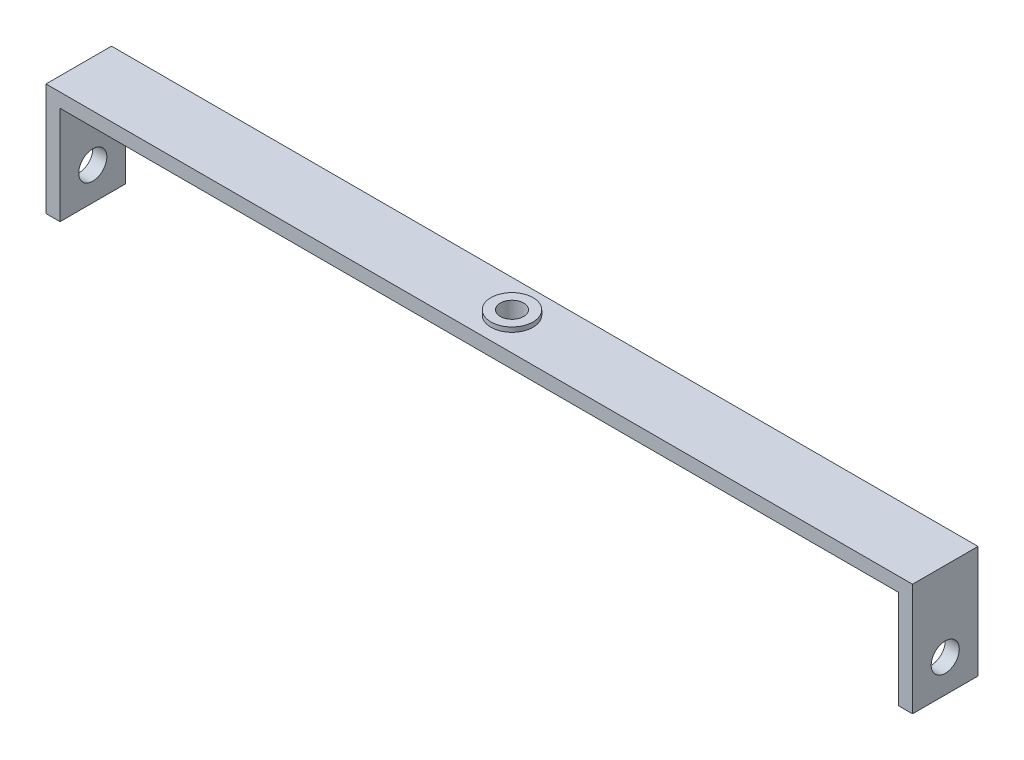
ISO-10303-21;
HEADER;
FILE_DESCRIPTION(('STEP AP214'),'2;1');
FILE_NAME('part.step','',(''),(''),'','','');
FILE_SCHEMA(('AUTOMOTIVE_DESIGN { 1 0 10303 214 1 1 1 1 }'));
ENDSEC;
DATA;
#1=APPLICATION_CONTEXT('core data for automotive mechanical design processes');
#2=APPLICATION_PROTOCOL_DEFINITION('international standard','automotive_design',2000,#1);
#3=PRODUCT_CONTEXT('',#1,'mechanical');
#4=PRODUCT('Part','Part','',(#3));
#5=PRODUCT_RELATED_PRODUCT_CATEGORY('part','',(#4));
#6=PRODUCT_DEFINITION_FORMATION('','',#4);
#7=PRODUCT_DEFINITION_CONTEXT('part definition',#1,'design');
#8=PRODUCT_DEFINITION('design','',#6,#7);
#9=PRODUCT_DEFINITION_SHAPE('','',#8);
#10=(LENGTH_UNIT() NAMED_UNIT(*) SI_UNIT(.MILLI.,.METRE.));
#11=(NAMED_UNIT(*) PLANE_ANGLE_UNIT() SI_UNIT($,.RADIAN.));
#12=(NAMED_UNIT(*) SI_UNIT($,.STERADIAN.) SOLID_ANGLE_UNIT());
#13=UNCERTAINTY_MEASURE_WITH_UNIT(LENGTH_MEASURE(1.E-05),#10,'distance_accuracy_value','');
#14=(GEOMETRIC_REPRESENTATION_CONTEXT(3) GLOBAL_UNCERTAINTY_ASSIGNED_CONTEXT((#13)) GLOBAL_UNIT_ASSIGNED_CONTEXT((#10,
#11,#12)) REPRESENTATION_CONTEXT('',''));
#15=CARTESIAN_POINT('',(0.,0.,0.));
#16=DIRECTION('',(0.,0.,1.));
#17=DIRECTION('',(1.,0.,0.));
#18=AXIS2_PLACEMENT_3D('',#15,#16,#17);
#19=CARTESIAN_POINT('',(-46.3,0.,-3.5));
#20=DIRECTION('',(0.,1.,0.));
#21=DIRECTION('',(-1.,0.,0.));
#22=AXIS2_PLACEMENT_3D('',#19,#20,#21);
#23=PLANE('',#22);
#24=DIRECTION('',(0.,0.,1.));
#25=VECTOR('',#24,1.);
#26=CARTESIAN_POINT('',(-46.3,0.,-3.5));
#27=LINE('',#26,#25);
#28=CARTESIAN_POINT('',(-46.3,0.,-3.5));
#29=VERTEX_POINT('',#28);
#30=CARTESIAN_POINT('',(-46.3,0.,3.5));
#31=VERTEX_POINT('',#30);
#32=EDGE_CURVE('E168',#29,#31,#27,.T.);
#33=ORIENTED_EDGE('',*,*,#32,.T.);
#34=DIRECTION('',(-1.,0.,0.));
#35=VECTOR('',#34,1.);
#36=CARTESIAN_POINT('',(-46.3,0.,3.5));
#37=LINE('',#36,#35);
#38=CARTESIAN_POINT('',(46.3,0.,3.5));
#39=VERTEX_POINT('',#38);
#40=EDGE_CURVE('E117',#39,#31,#37,.T.);
#41=ORIENTED_EDGE('',*,*,#40,.F.);
#42=DIRECTION('',(0.,0.,1.));
#43=VECTOR('',#42,1.);
#44=CARTESIAN_POINT('',(46.3,0.,-3.5));
#45=LINE('',#44,#43);
#46=CARTESIAN_POINT('',(46.3,0.,-3.5));
#47=VERTEX_POINT('',#46);
#48=EDGE_CURVE('E109',#47,#39,#45,.T.);
#49=ORIENTED_EDGE('',*,*,#48,.F.);
#50=DIRECTION('',(-1.,0.,0.));
#51=VECTOR('',#50,1.);
#52=CARTESIAN_POINT('',(-46.3,0.,-3.5));
#53=LINE('',#52,#51);
#54=EDGE_CURVE('E146',#47,#29,#53,.T.);
#55=ORIENTED_EDGE('',*,*,#54,.T.);
#56=EDGE_LOOP('',(#33,#41,#49,#55));
#57=FACE_BOUND('',#56,.T.);
#58=CARTESIAN_POINT('',(0.,0.,0.));
#59=DIRECTION('',(0.,1.,0.));
#60=DIRECTION('',(0.,0.,1.));
#61=AXIS2_PLACEMENT_3D('',#58,#59,#60);
#62=CIRCLE('',#61,2.25);
#63=CARTESIAN_POINT('',(0.,0.,2.25));
#64=VERTEX_POINT('',#63);
#65=EDGE_CURVE('E234',#64,#64,#62,.T.);
#66=ORIENTED_EDGE('',*,*,#65,.F.);
#67=EDGE_LOOP('',(#66));
#68=FACE_BOUND('',#67,.T.);
#69=ADVANCED_FACE('F39',(#57,#68),#23,.T.);
#70=CARTESIAN_POINT('',(44.8,-12.,-3.5));
#71=DIRECTION('',(0.,-1.,0.));
#72=DIRECTION('',(0.,0.,-1.));
#73=AXIS2_PLACEMENT_3D('',#70,#71,#72);
#74=PLANE('',#73);
#75=DIRECTION('',(0.,0.,1.));
#76=VECTOR('',#75,1.);
#77=CARTESIAN_POINT('',(46.3,-12.,-3.5));
#78=LINE('',#77,#76);
#79=CARTESIAN_POINT('',(46.3,-12.,-3.5));
#80=VERTEX_POINT('',#79);
#81=CARTESIAN_POINT('',(46.3,-12.,3.5));
#82=VERTEX_POINT('',#81);
#83=EDGE_CURVE('E43',#80,#82,#78,.T.);
#84=ORIENTED_EDGE('',*,*,#83,.T.);
#85=DIRECTION('',(1.,0.,0.));
#86=VECTOR('',#85,1.);
#87=CARTESIAN_POINT('',(44.8,-12.,3.5));
#88=LINE('',#87,#86);
#89=CARTESIAN_POINT('',(44.8,-12.,3.5));
#90=VERTEX_POINT('',#89);
#91=EDGE_CURVE('E104',#90,#82,#88,.T.);
#92=ORIENTED_EDGE('',*,*,#91,.F.);
#93=DIRECTION('',(0.,0.,1.));
#94=VECTOR('',#93,1.);
#95=CARTESIAN_POINT('',(44.8,-12.,-3.5));
#96=LINE('',#95,#94);
#97=CARTESIAN_POINT('',(44.8,-12.,-3.5));
#98=VERTEX_POINT('',#97);
#99=EDGE_CURVE('E11',#98,#90,#96,.T.);
#100=ORIENTED_EDGE('',*,*,#99,.F.);
#101=DIRECTION('',(1.,0.,0.));
#102=VECTOR('',#101,1.);
#103=CARTESIAN_POINT('',(44.8,-12.,-3.5));
#104=LINE('',#103,#102);
#105=EDGE_CURVE('E105',#98,#80,#104,.T.);
#106=ORIENTED_EDGE('',*,*,#105,.T.);
#107=EDGE_LOOP('',(#84,#92,#100,#106));
#108=FACE_BOUND('',#107,.T.);
#109=ADVANCED_FACE('F41',(#108),#74,.T.);
#110=CARTESIAN_POINT('',(44.8,-1.5,-3.5));
#111=DIRECTION('',(-1.,0.,0.));
#112=DIRECTION('',(0.,0.,1.));
#113=AXIS2_PLACEMENT_3D('',#110,#111,#112);
#114=PLANE('',#113);
#115=CARTESIAN_POINT('',(44.8,-8.5,0.));
#116=DIRECTION('',(-1.,0.,0.));
#117=DIRECTION('',(0.,0.,1.));
#118=AXIS2_PLACEMENT_3D('',#115,#116,#117);
#119=CIRCLE('',#118,1.5);
#120=CARTESIAN_POINT('',(44.8,-8.5,-1.5));
#121=VERTEX_POINT('',#120);
#122=EDGE_CURVE('E228',#121,#121,#119,.T.);
#123=ORIENTED_EDGE('',*,*,#122,.F.);
#124=EDGE_LOOP('',(#123));
#125=FACE_BOUND('',#124,.T.);
#126=ORIENTED_EDGE('',*,*,#99,.T.);
#127=DIRECTION('',(0.,-1.,0.));
#128=VECTOR('',#127,1.);
#129=CARTESIAN_POINT('',(44.8,-1.5,3.5));
#130=LINE('',#129,#128);
#131=CARTESIAN_POINT('',(44.8,-1.5,3.5));
#132=VERTEX_POINT('',#131);
#133=EDGE_CURVE('E122',#132,#90,#130,.T.);
#134=ORIENTED_EDGE('',*,*,#133,.F.);
#135=DIRECTION('',(0.,0.,1.));
#136=VECTOR('',#135,1.);
#137=CARTESIAN_POINT('',(44.8,-1.5,-3.5));
#138=LINE('',#137,#136);
#139=CARTESIAN_POINT('',(44.8,-1.5,-3.5));
#140=VERTEX_POINT('',#139);
#141=EDGE_CURVE('E48',#140,#132,#138,.T.);
#142=ORIENTED_EDGE('',*,*,#141,.F.);
#143=DIRECTION('',(0.,-1.,0.));
#144=VECTOR('',#143,1.);
#145=CARTESIAN_POINT('',(44.8,-1.5,-3.5));
#146=LINE('',#145,#144);
#147=EDGE_CURVE('E110',#140,#98,#146,.T.);
#148=ORIENTED_EDGE('',*,*,#147,.T.);
#149=EDGE_LOOP('',(#126,#134,#142,#148));
#150=FACE_BOUND('',#149,.T.);
#151=ADVANCED_FACE('F191',(#125,#150),#114,.T.);
#152=CARTESIAN_POINT('',(-44.8,-1.5,-3.5));
#153=DIRECTION('',(0.,-1.,0.));
#154=DIRECTION('',(0.,0.,-1.));
#155=AXIS2_PLACEMENT_3D('',#152,#153,#154);
#156=PLANE('',#155);
#157=CARTESIAN_POINT('',(0.,-1.5,0.));
#158=DIRECTION('',(0.,-1.,0.));
#159=DIRECTION('',(0.,0.,-1.));
#160=AXIS2_PLACEMENT_3D('',#157,#158,#159);
#161=CIRCLE('',#160,1.25);
#162=CARTESIAN_POINT('',(0.,-1.5,-1.25));
#163=VERTEX_POINT('',#162);
#164=EDGE_CURVE('E123',#163,#163,#161,.T.);
#165=ORIENTED_EDGE('',*,*,#164,.F.);
#166=EDGE_LOOP('',(#165));
#167=FACE_BOUND('',#166,.T.);
#168=ORIENTED_EDGE('',*,*,#141,.T.);
#169=DIRECTION('',(1.,0.,0.));
#170=VECTOR('',#169,1.);
#171=CARTESIAN_POINT('',(-44.8,-1.5,3.5));
#172=LINE('',#171,#170);
#173=CARTESIAN_POINT('',(-44.8,-1.5,3.5));
#174=VERTEX_POINT('',#173);
#175=EDGE_CURVE('E140',#174,#132,#172,.T.);
#176=ORIENTED_EDGE('',*,*,#175,.F.);
#177=DIRECTION('',(0.,0.,1.));
#178=VECTOR('',#177,1.);
#179=CARTESIAN_POINT('',(-44.8,-1.5,-3.5));
#180=LINE('',#179,#178);
#181=CARTESIAN_POINT('',(-44.8,-1.5,-3.5));
#182=VERTEX_POINT('',#181);
#183=EDGE_CURVE('E162',#182,#174,#180,.T.);
#184=ORIENTED_EDGE('',*,*,#183,.F.);
#185=DIRECTION('',(1.,0.,0.));
#186=VECTOR('',#185,1.);
#187=CARTESIAN_POINT('',(-44.8,-1.5,-3.5));
#188=LINE('',#187,#186);
#189=EDGE_CURVE('E158',#182,#140,#188,.T.);
#190=ORIENTED_EDGE('',*,*,#189,.T.);
#191=EDGE_LOOP('',(#168,#176,#184,#190));
#192=FACE_BOUND('',#191,.T.);
#193=ADVANCED_FACE('F190',(#167,#192),#156,.T.);
#194=CARTESIAN_POINT('',(-44.8,-1.5,-3.5));
#195=DIRECTION('',(1.,0.,0.));
#196=DIRECTION('',(0.,0.,-1.));
#197=AXIS2_PLACEMENT_3D('',#194,#195,#196);
#198=PLANE('',#197);
#199=CARTESIAN_POINT('',(-44.8,-8.5,0.));
#200=DIRECTION('',(1.,0.,0.));
#201=DIRECTION('',(0.,0.,-1.));
#202=AXIS2_PLACEMENT_3D('',#199,#200,#201);
#203=CIRCLE('',#202,1.5);
#204=CARTESIAN_POINT('',(-44.8,-8.5,-1.5));
#205=VERTEX_POINT('',#204);
#206=EDGE_CURVE('E223',#205,#205,#203,.T.);
#207=ORIENTED_EDGE('',*,*,#206,.F.);
#208=EDGE_LOOP('',(#207));
#209=FACE_BOUND('',#208,.T.);
#210=ORIENTED_EDGE('',*,*,#183,.T.);
#211=DIRECTION('',(0.,1.,0.));
#212=VECTOR('',#211,1.);
#213=CARTESIAN_POINT('',(-44.8,-1.5,3.5));
#214=LINE('',#213,#212);
#215=CARTESIAN_POINT('',(-44.8,-12.,3.5));
#216=VERTEX_POINT('',#215);
#217=EDGE_CURVE('E137',#216,#174,#214,.T.);
#218=ORIENTED_EDGE('',*,*,#217,.F.);
#219=DIRECTION('',(0.,0.,1.));
#220=VECTOR('',#219,1.);
#221=CARTESIAN_POINT('',(-44.8,-12.,-3.5));
#222=LINE('',#221,#220);
#223=CARTESIAN_POINT('',(-44.8,-12.,-3.5));
#224=VERTEX_POINT('',#223);
#225=EDGE_CURVE('E164',#224,#216,#222,.T.);
#226=ORIENTED_EDGE('',*,*,#225,.F.);
#227=DIRECTION('',(0.,1.,0.));
#228=VECTOR('',#227,1.);
#229=CARTESIAN_POINT('',(-44.8,-1.5,-3.5));
#230=LINE('',#229,#228);
#231=EDGE_CURVE('E155',#224,#182,#230,.T.);
#232=ORIENTED_EDGE('',*,*,#231,.T.);
#233=EDGE_LOOP('',(#210,#218,#226,#232));
#234=FACE_BOUND('',#233,.T.);
#235=ADVANCED_FACE('F186',(#209,#234),#198,.T.);
#236=CARTESIAN_POINT('',(-46.3,-12.,-3.5));
#237=DIRECTION('',(0.,-1.,0.));
#238=DIRECTION('',(0.,0.,-1.));
#239=AXIS2_PLACEMENT_3D('',#236,#237,#238);
#240=PLANE('',#239);
#241=ORIENTED_EDGE('',*,*,#225,.T.);
#242=DIRECTION('',(1.,0.,0.));
#243=VECTOR('',#242,1.);
#244=CARTESIAN_POINT('',(-46.3,-12.,3.5));
#245=LINE('',#244,#243);
#246=CARTESIAN_POINT('',(-46.3,-12.,3.5));
#247=VERTEX_POINT('',#246);
#248=EDGE_CURVE('E134',#247,#216,#245,.T.);
#249=ORIENTED_EDGE('',*,*,#248,.F.);
#250=DIRECTION('',(0.,0.,1.));
#251=VECTOR('',#250,1.);
#252=CARTESIAN_POINT('',(-46.3,-12.,-3.5));
#253=LINE('',#252,#251);
#254=CARTESIAN_POINT('',(-46.3,-12.,-3.5));
#255=VERTEX_POINT('',#254);
#256=EDGE_CURVE('E166',#255,#247,#253,.T.);
#257=ORIENTED_EDGE('',*,*,#256,.F.);
#258=DIRECTION('',(1.,0.,0.));
#259=VECTOR('',#258,1.);
#260=CARTESIAN_POINT('',(-46.3,-12.,-3.5));
#261=LINE('',#260,#259);
#262=EDGE_CURVE('E152',#255,#224,#261,.T.);
#263=ORIENTED_EDGE('',*,*,#262,.T.);
#264=EDGE_LOOP('',(#241,#249,#257,#263));
#265=FACE_BOUND('',#264,.T.);
#266=ADVANCED_FACE('F179',(#265),#240,.T.);
#267=CARTESIAN_POINT('',(-46.3,0.,-3.5));
#268=DIRECTION('',(-1.,0.,0.));
#269=DIRECTION('',(0.,-1.,0.));
#270=AXIS2_PLACEMENT_3D('',#267,#268,#269);
#271=PLANE('',#270);
#272=CARTESIAN_POINT('',(-46.3,-8.5,0.));
#273=DIRECTION('',(-1.,0.,0.));
#274=DIRECTION('',(0.,-1.,0.));
#275=AXIS2_PLACEMENT_3D('',#272,#273,#274);
#276=CIRCLE('',#275,1.5);
#277=CARTESIAN_POINT('',(-46.3,-8.5,-1.5));
#278=VERTEX_POINT('',#277);
#279=EDGE_CURVE('E220',#278,#278,#276,.F.);
#280=ORIENTED_EDGE('',*,*,#279,.T.);
#281=EDGE_LOOP('',(#280));
#282=FACE_BOUND('',#281,.T.);
#283=ORIENTED_EDGE('',*,*,#256,.T.);
#284=DIRECTION('',(0.,-1.,0.));
#285=VECTOR('',#284,1.);
#286=CARTESIAN_POINT('',(-46.3,0.,3.5));
#287=LINE('',#286,#285);
#288=EDGE_CURVE('E131',#31,#247,#287,.T.);
#289=ORIENTED_EDGE('',*,*,#288,.F.);
#290=ORIENTED_EDGE('',*,*,#32,.F.);
#291=DIRECTION('',(0.,-1.,0.));
#292=VECTOR('',#291,1.);
#293=CARTESIAN_POINT('',(-46.3,0.,-3.5));
#294=LINE('',#293,#292);
#295=EDGE_CURVE('E149',#29,#255,#294,.T.);
#296=ORIENTED_EDGE('',*,*,#295,.T.);
#297=EDGE_LOOP('',(#283,#289,#290,#296));
#298=FACE_BOUND('',#297,.T.);
#299=ADVANCED_FACE('F176',(#282,#298),#271,.T.);
#300=CARTESIAN_POINT('',(46.3,0.,-3.5));
#301=DIRECTION('',(1.,0.,0.));
#302=DIRECTION('',(0.,1.,0.));
#303=AXIS2_PLACEMENT_3D('',#300,#301,#302);
#304=PLANE('',#303);
#305=CARTESIAN_POINT('',(46.3,-8.5,0.));
#306=DIRECTION('',(1.,0.,0.));
#307=DIRECTION('',(0.,1.,0.));
#308=AXIS2_PLACEMENT_3D('',#305,#306,#307);
#309=CIRCLE('',#308,1.5);
#310=CARTESIAN_POINT('',(46.3,-8.5,-1.5));
#311=VERTEX_POINT('',#310);
#312=EDGE_CURVE('E218',#311,#311,#309,.T.);
#313=ORIENTED_EDGE('',*,*,#312,.F.);
#314=EDGE_LOOP('',(#313));
#315=FACE_BOUND('',#314,.T.);
#316=ORIENTED_EDGE('',*,*,#48,.T.);
#317=DIRECTION('',(0.,1.,0.));
#318=VECTOR('',#317,1.);
#319=CARTESIAN_POINT('',(46.3,0.,3.5));
#320=LINE('',#319,#318);
#321=EDGE_CURVE('E112',#82,#39,#320,.T.);
#322=ORIENTED_EDGE('',*,*,#321,.F.);
#323=ORIENTED_EDGE('',*,*,#83,.F.);
#324=DIRECTION('',(0.,1.,0.));
#325=VECTOR('',#324,1.);
#326=CARTESIAN_POINT('',(46.3,0.,-3.5));
#327=LINE('',#326,#325);
#328=EDGE_CURVE('E144',#80,#47,#327,.T.);
#329=ORIENTED_EDGE('',*,*,#328,.T.);
#330=EDGE_LOOP('',(#316,#322,#323,#329));
#331=FACE_BOUND('',#330,.T.);
#332=ADVANCED_FACE('F113',(#315,#331),#304,.T.);
#333=CARTESIAN_POINT('',(0.,0.,-3.5));
#334=DIRECTION('',(0.,0.,-1.));
#335=DIRECTION('',(-1.,0.,0.));
#336=AXIS2_PLACEMENT_3D('',#333,#334,#335);
#337=PLANE('',#336);
#338=ORIENTED_EDGE('',*,*,#105,.F.);
#339=ORIENTED_EDGE('',*,*,#147,.F.);
#340=ORIENTED_EDGE('',*,*,#189,.F.);
#341=ORIENTED_EDGE('',*,*,#231,.F.);
#342=ORIENTED_EDGE('',*,*,#262,.F.);
#343=ORIENTED_EDGE('',*,*,#295,.F.);
#344=ORIENTED_EDGE('',*,*,#54,.F.);
#345=ORIENTED_EDGE('',*,*,#328,.F.);
#346=EDGE_LOOP('',(#338,#339,#340,#341,#342,#343,#344,#345));
#347=FACE_BOUND('',#346,.T.);
#348=ADVANCED_FACE('F182',(#347),#337,.T.);
#349=CARTESIAN_POINT('',(0.,0.,3.5));
#350=DIRECTION('',(0.,0.,-1.));
#351=DIRECTION('',(-1.,0.,0.));
#352=AXIS2_PLACEMENT_3D('',#349,#350,#351);
#353=PLANE('',#352);
#354=ORIENTED_EDGE('',*,*,#91,.T.);
#355=ORIENTED_EDGE('',*,*,#321,.T.);
#356=ORIENTED_EDGE('',*,*,#40,.T.);
#357=ORIENTED_EDGE('',*,*,#288,.T.);
#358=ORIENTED_EDGE('',*,*,#248,.T.);
#359=ORIENTED_EDGE('',*,*,#217,.T.);
#360=ORIENTED_EDGE('',*,*,#175,.T.);
#361=ORIENTED_EDGE('',*,*,#133,.T.);
#362=EDGE_LOOP('',(#354,#355,#356,#357,#358,#359,#360,#361));
#363=FACE_BOUND('',#362,.T.);
#364=ADVANCED_FACE('F120',(#363),#353,.F.);
#365=CARTESIAN_POINT('',(0.,-3.5,0.));
#366=DIRECTION('',(0.,1.,0.));
#367=DIRECTION('',(0.,0.,1.));
#368=AXIS2_PLACEMENT_3D('',#365,#366,#367);
#369=CYLINDRICAL_SURFACE('',#368,1.25);
#370=ORIENTED_EDGE('',*,*,#164,.T.);
#371=EDGE_LOOP('',(#370));
#372=FACE_BOUND('',#371,.T.);
#373=CARTESIAN_POINT('',(0.,0.5,0.));
#374=DIRECTION('',(0.,1.,0.));
#375=DIRECTION('',(0.,0.,1.));
#376=AXIS2_PLACEMENT_3D('',#373,#374,#375);
#377=CIRCLE('',#376,1.25);
#378=CARTESIAN_POINT('',(0.,0.5,1.25));
#379=VERTEX_POINT('',#378);
#380=EDGE_CURVE('E231',#379,#379,#377,.T.);
#381=ORIENTED_EDGE('',*,*,#380,.T.);
#382=EDGE_LOOP('',(#381));
#383=FACE_BOUND('',#382,.T.);
#384=ADVANCED_FACE('F252',(#372,#383),#369,.F.);
#385=CARTESIAN_POINT('',(0.,0.5,0.));
#386=DIRECTION('',(0.,1.,0.));
#387=DIRECTION('',(0.,0.,1.));
#388=AXIS2_PLACEMENT_3D('',#385,#386,#387);
#389=PLANE('',#388);
#390=CARTESIAN_POINT('',(0.,0.5,0.));
#391=DIRECTION('',(0.,1.,0.));
#392=DIRECTION('',(0.,0.,1.));
#393=AXIS2_PLACEMENT_3D('',#390,#391,#392);
#394=CIRCLE('',#393,2.25);
#395=CARTESIAN_POINT('',(0.,0.5,2.25));
#396=VERTEX_POINT('',#395);
#397=EDGE_CURVE('E126',#396,#396,#394,.T.);
#398=ORIENTED_EDGE('',*,*,#397,.T.);
#399=EDGE_LOOP('',(#398));
#400=FACE_BOUND('',#399,.T.);
#401=ORIENTED_EDGE('',*,*,#380,.F.);
#402=EDGE_LOOP('',(#401));
#403=FACE_BOUND('',#402,.T.);
#404=ADVANCED_FACE('F242',(#400,#403),#389,.T.);
#405=CARTESIAN_POINT('',(0.,0.5,0.));
#406=DIRECTION('',(0.,-1.,0.));
#407=DIRECTION('',(0.,0.,-1.));
#408=AXIS2_PLACEMENT_3D('',#405,#406,#407);
#409=CYLINDRICAL_SURFACE('',#408,2.25);
#410=ORIENTED_EDGE('',*,*,#397,.F.);
#411=EDGE_LOOP('',(#410));
#412=FACE_BOUND('',#411,.T.);
#413=ORIENTED_EDGE('',*,*,#65,.T.);
#414=EDGE_LOOP('',(#413));
#415=FACE_BOUND('',#414,.T.);
#416=ADVANCED_FACE('F239',(#412,#415),#409,.T.);
#417=CARTESIAN_POINT('',(-50.5426406871193,-8.5,0.));
#418=DIRECTION('',(1.,0.,0.));
#419=DIRECTION('',(0.,0.,-1.));
#420=AXIS2_PLACEMENT_3D('',#417,#418,#419);
#421=CYLINDRICAL_SURFACE('',#420,1.5);
#422=CARTESIAN_POINT('',(44.8,-8.5,-1.5));
#423=CARTESIAN_POINT('',(44.815625,-8.5,-1.5));
#424=CARTESIAN_POINT('',(44.83125,-8.5,-1.5));
#425=CARTESIAN_POINT('',(44.8625,-8.5,-1.5));
#426=CARTESIAN_POINT('',(44.878125,-8.5,-1.5));
#427=CARTESIAN_POINT('',(44.909375,-8.5,-1.5));
#428=CARTESIAN_POINT('',(44.925,-8.5,-1.5));
#429=CARTESIAN_POINT('',(44.95625,-8.5,-1.5));
#430=CARTESIAN_POINT('',(44.971875,-8.5,-1.5));
#431=CARTESIAN_POINT('',(45.003125,-8.5,-1.5));
#432=CARTESIAN_POINT('',(45.01875,-8.5,-1.5));
#433=CARTESIAN_POINT('',(45.05,-8.5,-1.5));
#434=CARTESIAN_POINT('',(45.065625,-8.5,-1.5));
#435=CARTESIAN_POINT('',(45.096875,-8.5,-1.5));
#436=CARTESIAN_POINT('',(45.1125,-8.5,-1.5));
#437=CARTESIAN_POINT('',(45.14375,-8.5,-1.5));
#438=CARTESIAN_POINT('',(45.159375,-8.5,-1.5));
#439=CARTESIAN_POINT('',(45.190625,-8.5,-1.5));
#440=CARTESIAN_POINT('',(45.20625,-8.5,-1.5));
#441=CARTESIAN_POINT('',(45.2375,-8.5,-1.5));
#442=CARTESIAN_POINT('',(45.253125,-8.5,-1.5));
#443=CARTESIAN_POINT('',(45.284375,-8.5,-1.5));
#444=CARTESIAN_POINT('',(45.3,-8.5,-1.5));
#445=CARTESIAN_POINT('',(45.33125,-8.5,-1.5));
#446=CARTESIAN_POINT('',(45.346875,-8.5,-1.5));
#447=CARTESIAN_POINT('',(45.378125,-8.5,-1.5));
#448=CARTESIAN_POINT('',(45.39375,-8.5,-1.5));
#449=CARTESIAN_POINT('',(45.425,-8.5,-1.5));
#450=CARTESIAN_POINT('',(45.440625,-8.5,-1.5));
#451=CARTESIAN_POINT('',(45.471875,-8.5,-1.5));
#452=CARTESIAN_POINT('',(45.4875,-8.5,-1.5));
#453=CARTESIAN_POINT('',(45.51875,-8.5,-1.5));
#454=CARTESIAN_POINT('',(45.534375,-8.5,-1.5));
#455=CARTESIAN_POINT('',(45.565625,-8.5,-1.5));
#456=CARTESIAN_POINT('',(45.58125,-8.5,-1.5));
#457=CARTESIAN_POINT('',(45.6125,-8.5,-1.5));
#458=CARTESIAN_POINT('',(45.628125,-8.5,-1.5));
#459=CARTESIAN_POINT('',(45.659375,-8.5,-1.5));
#460=CARTESIAN_POINT('',(45.675,-8.5,-1.5));
#461=CARTESIAN_POINT('',(45.70625,-8.5,-1.5));
#462=CARTESIAN_POINT('',(45.721875,-8.5,-1.5));
#463=CARTESIAN_POINT('',(45.753125,-8.5,-1.5));
#464=CARTESIAN_POINT('',(45.76875,-8.5,-1.5));
#465=CARTESIAN_POINT('',(45.8,-8.5,-1.5));
#466=CARTESIAN_POINT('',(45.815625,-8.5,-1.5));
#467=CARTESIAN_POINT('',(45.846875,-8.5,-1.5));
#468=CARTESIAN_POINT('',(45.8625,-8.5,-1.5));
#469=CARTESIAN_POINT('',(45.89375,-8.5,-1.5));
#470=CARTESIAN_POINT('',(45.909375,-8.5,-1.5));
#471=CARTESIAN_POINT('',(45.940625,-8.5,-1.5));
#472=CARTESIAN_POINT('',(45.95625,-8.5,-1.5));
#473=CARTESIAN_POINT('',(45.9875,-8.5,-1.5));
#474=CARTESIAN_POINT('',(46.003125,-8.5,-1.5));
#475=CARTESIAN_POINT('',(46.034375,-8.5,-1.5));
#476=CARTESIAN_POINT('',(46.05,-8.5,-1.5));
#477=CARTESIAN_POINT('',(46.08125,-8.5,-1.5));
#478=CARTESIAN_POINT('',(46.096875,-8.5,-1.5));
#479=CARTESIAN_POINT('',(46.128125,-8.5,-1.5));
#480=CARTESIAN_POINT('',(46.14375,-8.5,-1.5));
#481=CARTESIAN_POINT('',(46.175,-8.5,-1.5));
#482=CARTESIAN_POINT('',(46.190625,-8.5,-1.5));
#483=CARTESIAN_POINT('',(46.221875,-8.5,-1.5));
#484=CARTESIAN_POINT('',(46.2375,-8.5,-1.5));
#485=CARTESIAN_POINT('',(46.26875,-8.5,-1.5));
#486=CARTESIAN_POINT('',(46.284375,-8.5,-1.5));
#487=CARTESIAN_POINT('',(46.3,-8.5,-1.5));
#488=B_SPLINE_CURVE_WITH_KNOTS('',3,(#422,#423,#424,#425,#426,#427,#428,#429,#430,#431,#432,
#433,#434,#435,#436,#437,#438,#439,#440,#441,#442,#443,#444,#445,#446,#447,#448,#449,#450,#451,
#452,#453,#454,#455,#456,#457,#458,#459,#460,#461,#462,#463,#464,#465,#466,#467,#468,#469,#470,
#471,#472,#473,#474,#475,#476,#477,#478,#479,#480,#481,#482,#483,#484,#485,#486,#487),
.UNSPECIFIED.,.F.,.F.,(4,2,2,2,2,2,2,2,2,2,2,2,2,2,2,2,2,2,2,2,2,2,2,2,2,2,2,2,2,2,2,2,4),(0.,
0.0468750000000018,0.0937500000000036,0.140624999999991,0.187499999999993,0.234374999999995,
0.281249999999997,0.328124999999999,0.374999999999986,0.421874999999988,0.46874999999999,
0.515624999999992,0.562499999999994,0.609374999999995,0.656249999999983,0.703124999999985,
0.749999999999987,0.796874999999989,0.84374999999999,0.890624999999978,0.93749999999998,
0.984374999999982,1.03124999999998,1.07812499999999,1.12499999999999,1.17187499999998,
1.21874999999998,1.26562499999998,1.31249999999998,1.35937499999998,1.40624999999997,
1.45312499999997,1.49999999999997),.UNSPECIFIED.);
#489=EDGE_CURVE('BSEAM241',#121,#311,#488,.T.);
#490=ORIENTED_EDGE('',*,*,#122,.T.);
#491=ORIENTED_EDGE('',*,*,#312,.T.);
#492=ORIENTED_EDGE('',*,*,#489,.T.);
#493=ORIENTED_EDGE('',*,*,#489,.F.);
#494=EDGE_LOOP('',(#490,#492,#491,#493));
#495=FACE_BOUND('',#494,.T.);
#496=ADVANCED_FACE('F241',(#495),#421,.F.);
#497=CARTESIAN_POINT('',(-44.8,-8.5,-1.5));
#498=CARTESIAN_POINT('',(-44.815625,-8.5,-1.5));
#499=CARTESIAN_POINT('',(-44.83125,-8.5,-1.5));
#500=CARTESIAN_POINT('',(-44.8625,-8.5,-1.5));
#501=CARTESIAN_POINT('',(-44.878125,-8.5,-1.5));
#502=CARTESIAN_POINT('',(-44.909375,-8.5,-1.5));
#503=CARTESIAN_POINT('',(-44.925,-8.5,-1.5));
#504=CARTESIAN_POINT('',(-44.95625,-8.5,-1.5));
#505=CARTESIAN_POINT('',(-44.971875,-8.5,-1.5));
#506=CARTESIAN_POINT('',(-45.003125,-8.5,-1.5));
#507=CARTESIAN_POINT('',(-45.01875,-8.5,-1.5));
#508=CARTESIAN_POINT('',(-45.05,-8.5,-1.5));
#509=CARTESIAN_POINT('',(-45.065625,-8.5,-1.5));
#510=CARTESIAN_POINT('',(-45.096875,-8.5,-1.5));
#511=CARTESIAN_POINT('',(-45.1125,-8.5,-1.5));
#512=CARTESIAN_POINT('',(-45.14375,-8.5,-1.5));
#513=CARTESIAN_POINT('',(-45.159375,-8.5,-1.5));
#514=CARTESIAN_POINT('',(-45.190625,-8.5,-1.5));
#515=CARTESIAN_POINT('',(-45.20625,-8.5,-1.5));
#516=CARTESIAN_POINT('',(-45.2375,-8.5,-1.5));
#517=CARTESIAN_POINT('',(-45.253125,-8.5,-1.5));
#518=CARTESIAN_POINT('',(-45.284375,-8.5,-1.5));
#519=CARTESIAN_POINT('',(-45.3,-8.5,-1.5));
#520=CARTESIAN_POINT('',(-45.33125,-8.5,-1.5));
#521=CARTESIAN_POINT('',(-45.346875,-8.5,-1.5));
#522=CARTESIAN_POINT('',(-45.378125,-8.5,-1.5));
#523=CARTESIAN_POINT('',(-45.39375,-8.5,-1.5));
#524=CARTESIAN_POINT('',(-45.425,-8.5,-1.5));
#525=CARTESIAN_POINT('',(-45.440625,-8.5,-1.5));
#526=CARTESIAN_POINT('',(-45.471875,-8.5,-1.5));
#527=CARTESIAN_POINT('',(-45.4875,-8.5,-1.5));
#528=CARTESIAN_POINT('',(-45.51875,-8.5,-1.5));
#529=CARTESIAN_POINT('',(-45.534375,-8.5,-1.5));
#530=CARTESIAN_POINT('',(-45.565625,-8.5,-1.5));
#531=CARTESIAN_POINT('',(-45.58125,-8.5,-1.5));
#532=CARTESIAN_POINT('',(-45.6125,-8.5,-1.5));
#533=CARTESIAN_POINT('',(-45.628125,-8.5,-1.5));
#534=CARTESIAN_POINT('',(-45.659375,-8.5,-1.5));
#535=CARTESIAN_POINT('',(-45.675,-8.5,-1.5));
#536=CARTESIAN_POINT('',(-45.70625,-8.5,-1.5));
#537=CARTESIAN_POINT('',(-45.721875,-8.5,-1.5));
#538=CARTESIAN_POINT('',(-45.753125,-8.5,-1.5));
#539=CARTESIAN_POINT('',(-45.76875,-8.5,-1.5));
#540=CARTESIAN_POINT('',(-45.8,-8.5,-1.5));
#541=CARTESIAN_POINT('',(-45.815625,-8.5,-1.5));
#542=CARTESIAN_POINT('',(-45.846875,-8.5,-1.5));
#543=CARTESIAN_POINT('',(-45.8625,-8.5,-1.5));
#544=CARTESIAN_POINT('',(-45.89375,-8.5,-1.5));
#545=CARTESIAN_POINT('',(-45.909375,-8.5,-1.5));
#546=CARTESIAN_POINT('',(-45.940625,-8.5,-1.5));
#547=CARTESIAN_POINT('',(-45.95625,-8.5,-1.5));
#548=CARTESIAN_POINT('',(-45.9875,-8.5,-1.5));
#549=CARTESIAN_POINT('',(-46.003125,-8.5,-1.5));
#550=CARTESIAN_POINT('',(-46.034375,-8.5,-1.5));
#551=CARTESIAN_POINT('',(-46.05,-8.5,-1.5));
#552=CARTESIAN_POINT('',(-46.08125,-8.5,-1.5));
#553=CARTESIAN_POINT('',(-46.096875,-8.5,-1.5));
#554=CARTESIAN_POINT('',(-46.128125,-8.5,-1.5));
#555=CARTESIAN_POINT('',(-46.14375,-8.5,-1.5));
#556=CARTESIAN_POINT('',(-46.175,-8.5,-1.5));
#557=CARTESIAN_POINT('',(-46.190625,-8.5,-1.5));
#558=CARTESIAN_POINT('',(-46.221875,-8.5,-1.5));
#559=CARTESIAN_POINT('',(-46.2375,-8.5,-1.5));
#560=CARTESIAN_POINT('',(-46.26875,-8.5,-1.5));
#561=CARTESIAN_POINT('',(-46.284375,-8.5,-1.5));
#562=CARTESIAN_POINT('',(-46.3,-8.5,-1.5));
#563=B_SPLINE_CURVE_WITH_KNOTS('',3,(#497,#498,#499,#500,#501,#502,#503,#504,#505,#506,#507,
#508,#509,#510,#511,#512,#513,#514,#515,#516,#517,#518,#519,#520,#521,#522,#523,#524,#525,#526,
#527,#528,#529,#530,#531,#532,#533,#534,#535,#536,#537,#538,#539,#540,#541,#542,#543,#544,#545,
#546,#547,#548,#549,#550,#551,#552,#553,#554,#555,#556,#557,#558,#559,#560,#561,#562),
.UNSPECIFIED.,.F.,.F.,(4,2,2,2,2,2,2,2,2,2,2,2,2,2,2,2,2,2,2,2,2,2,2,2,2,2,2,2,2,2,2,2,4),(0.,
0.0468749999999948,0.0937499999999966,0.140624999999998,0.1875,0.234374999999995,
0.281249999999997,0.328124999999999,0.375,0.421874999999995,0.468749999999997,0.515624999999999,
0.5625,0.609374999999995,0.656249999999997,0.703124999999999,0.750000000000001,
0.796874999999996,0.843749999999997,0.890624999999999,0.937500000000001,0.984374999999996,
1.03125,1.078125,1.125,1.171875,1.21875,1.265625,1.3125,1.359375,1.40625,1.453125,1.5),.UNSPECIFIED.);
#564=EDGE_CURVE('BSEAM249',#205,#278,#563,.T.);
#565=ORIENTED_EDGE('',*,*,#206,.T.);
#566=ORIENTED_EDGE('',*,*,#279,.F.);
#567=ORIENTED_EDGE('',*,*,#564,.T.);
#568=ORIENTED_EDGE('',*,*,#564,.F.);
#569=EDGE_LOOP('',(#565,#567,#566,#568));
#570=FACE_BOUND('',#569,.T.);
#571=ADVANCED_FACE('F249',(#570),#421,.F.);
#572=CLOSED_SHELL('',(#69,#109,#151,#193,#235,#266,#299,#332,#348,#364,#384,#404,#416,#496,#571));
#573=MANIFOLD_SOLID_BREP('B2',#572);
#574=ADVANCED_BREP_SHAPE_REPRESENTATION('',(#18,#573),#14);
#575=SHAPE_DEFINITION_REPRESENTATION(#9,#574);
ENDSEC;
END-ISO-10303-21;
